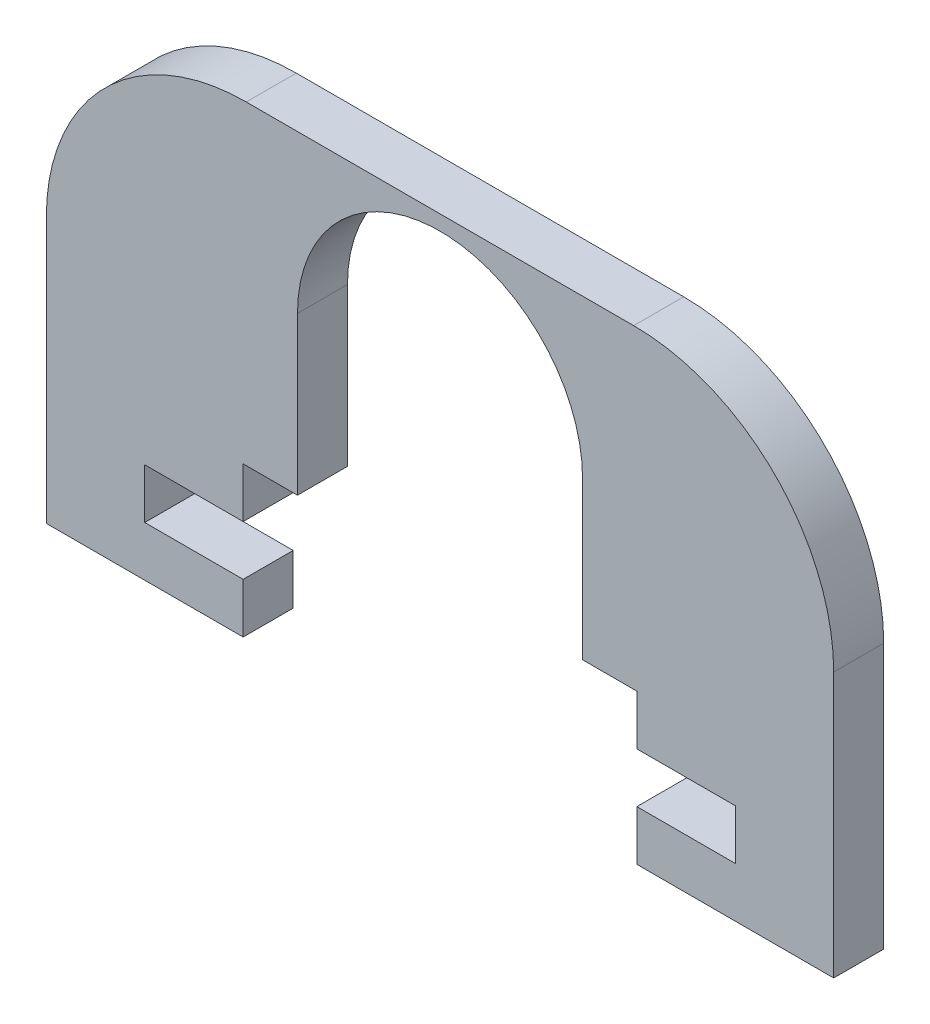
ISO-10303-21;
HEADER;
FILE_DESCRIPTION(('STEP AP214'),'2;1');
FILE_NAME('part.step','',(''),(''),'','','');
FILE_SCHEMA(('AUTOMOTIVE_DESIGN { 1 0 10303 214 1 1 1 1 }'));
ENDSEC;
DATA;
#1=APPLICATION_CONTEXT('core data for automotive mechanical design processes');
#2=APPLICATION_PROTOCOL_DEFINITION('international standard','automotive_design',2000,#1);
#3=PRODUCT_CONTEXT('',#1,'mechanical');
#4=PRODUCT('Part','Part','',(#3));
#5=PRODUCT_RELATED_PRODUCT_CATEGORY('part','',(#4));
#6=PRODUCT_DEFINITION_FORMATION('','',#4);
#7=PRODUCT_DEFINITION_CONTEXT('part definition',#1,'design');
#8=PRODUCT_DEFINITION('design','',#6,#7);
#9=PRODUCT_DEFINITION_SHAPE('','',#8);
#10=(LENGTH_UNIT() NAMED_UNIT(*) SI_UNIT(.MILLI.,.METRE.));
#11=(NAMED_UNIT(*) PLANE_ANGLE_UNIT() SI_UNIT($,.RADIAN.));
#12=(NAMED_UNIT(*) SI_UNIT($,.STERADIAN.) SOLID_ANGLE_UNIT());
#13=UNCERTAINTY_MEASURE_WITH_UNIT(LENGTH_MEASURE(1.E-05),#10,'distance_accuracy_value','');
#14=(GEOMETRIC_REPRESENTATION_CONTEXT(3) GLOBAL_UNCERTAINTY_ASSIGNED_CONTEXT((#13)) GLOBAL_UNIT_ASSIGNED_CONTEXT((#10,
#11,#12)) REPRESENTATION_CONTEXT('',''));
#15=CARTESIAN_POINT('',(0.,0.,0.));
#16=DIRECTION('',(0.,0.,1.));
#17=DIRECTION('',(1.,0.,0.));
#18=AXIS2_PLACEMENT_3D('',#15,#16,#17);
#19=CARTESIAN_POINT('',(0.,0.,6.35));
#20=DIRECTION('',(0.,0.,1.));
#21=DIRECTION('',(1.,0.,0.));
#22=AXIS2_PLACEMENT_3D('',#19,#20,#21);
#23=PLANE('',#22);
#24=DIRECTION('',(-1.,0.,0.));
#25=VECTOR('',#24,1.);
#26=CARTESIAN_POINT('',(0.,-6.35,6.35));
#27=LINE('',#26,#25);
#28=CARTESIAN_POINT('',(24.9999999745,-6.35,6.35));
#29=VERTEX_POINT('',#28);
#30=CARTESIAN_POINT('',(12.49999998725,-6.35,6.35));
#31=VERTEX_POINT('',#30);
#32=EDGE_CURVE('E235',#29,#31,#27,.T.);
#33=ORIENTED_EDGE('',*,*,#32,.F.);
#34=DIRECTION('',(0.,1.,0.));
#35=VECTOR('',#34,1.);
#36=CARTESIAN_POINT('',(24.9999999745,-19.05,6.35));
#37=LINE('',#36,#35);
#38=CARTESIAN_POINT('',(24.9999999745,0.,6.35));
#39=VERTEX_POINT('',#38);
#40=EDGE_CURVE('E271',#29,#39,#37,.T.);
#41=ORIENTED_EDGE('',*,*,#40,.T.);
#42=DIRECTION('',(1.,0.,0.));
#43=VECTOR('',#42,1.);
#44=CARTESIAN_POINT('',(24.9999999745,0.,6.35));
#45=LINE('',#44,#43);
#46=CARTESIAN_POINT('',(31.899999954,0.,6.35));
#47=VERTEX_POINT('',#46);
#48=EDGE_CURVE('E276',#39,#47,#45,.T.);
#49=ORIENTED_EDGE('',*,*,#48,.T.);
#50=DIRECTION('',(0.,-1.,0.));
#51=VECTOR('',#50,1.);
#52=CARTESIAN_POINT('',(31.899999954,0.,6.35));
#53=LINE('',#52,#51);
#54=CARTESIAN_POINT('',(31.899999954,20.000000005,6.35));
#55=VERTEX_POINT('',#54);
#56=EDGE_CURVE('E260',#55,#47,#53,.T.);
#57=ORIENTED_EDGE('',*,*,#56,.F.);
#58=CARTESIAN_POINT('',(49.999999949,20.000000005,6.35));
#59=DIRECTION('',(0.,0.,1.));
#60=DIRECTION('',(1.,0.,0.));
#61=AXIS2_PLACEMENT_3D('',#58,#59,#60);
#62=CIRCLE('',#61,18.099999995);
#63=CARTESIAN_POINT('',(68.099999944,20.000000005,6.35));
#64=VERTEX_POINT('',#63);
#65=EDGE_CURVE('E252',#64,#55,#62,.T.);
#66=ORIENTED_EDGE('',*,*,#65,.F.);
#67=DIRECTION('',(0.,-1.,0.));
#68=VECTOR('',#67,1.);
#69=CARTESIAN_POINT('',(68.099999944,0.,6.35));
#70=LINE('',#69,#68);
#71=CARTESIAN_POINT('',(68.099999944,0.,6.35));
#72=VERTEX_POINT('',#71);
#73=EDGE_CURVE('E262',#64,#72,#70,.T.);
#74=ORIENTED_EDGE('',*,*,#73,.T.);
#75=CARTESIAN_POINT('',(74.9999999235,0.,6.35));
#76=VERTEX_POINT('',#75);
#77=EDGE_CURVE('E275',#72,#76,#45,.T.);
#78=ORIENTED_EDGE('',*,*,#77,.T.);
#79=DIRECTION('',(0.,-1.,0.));
#80=VECTOR('',#79,1.);
#81=CARTESIAN_POINT('',(74.9999999235,0.,6.35));
#82=LINE('',#81,#80);
#83=CARTESIAN_POINT('',(74.9999999235,-6.35,6.35));
#84=VERTEX_POINT('',#83);
#85=EDGE_CURVE('E280',#76,#84,#82,.T.);
#86=ORIENTED_EDGE('',*,*,#85,.T.);
#87=DIRECTION('',(1.,0.,0.));
#88=VECTOR('',#87,1.);
#89=CARTESIAN_POINT('',(0.,-6.34999999999998,6.35));
#90=LINE('',#89,#88);
#91=CARTESIAN_POINT('',(87.49999991075,-6.35,6.35));
#92=VERTEX_POINT('',#91);
#93=EDGE_CURVE('E231',#84,#92,#90,.T.);
#94=ORIENTED_EDGE('',*,*,#93,.T.);
#95=DIRECTION('',(0.,-1.,0.));
#96=VECTOR('',#95,1.);
#97=CARTESIAN_POINT('',(87.49999991075,0.,6.35));
#98=LINE('',#97,#96);
#99=CARTESIAN_POINT('',(87.49999991075,-12.7,6.35));
#100=VERTEX_POINT('',#99);
#101=EDGE_CURVE('E237',#92,#100,#98,.T.);
#102=ORIENTED_EDGE('',*,*,#101,.T.);
#103=DIRECTION('',(-1.,0.,0.));
#104=VECTOR('',#103,1.);
#105=CARTESIAN_POINT('',(0.,-12.7,6.35));
#106=LINE('',#105,#104);
#107=CARTESIAN_POINT('',(74.9999999235,-12.7,6.35));
#108=VERTEX_POINT('',#107);
#109=EDGE_CURVE('E213',#100,#108,#106,.T.);
#110=ORIENTED_EDGE('',*,*,#109,.T.);
#111=CARTESIAN_POINT('',(74.9999999235,-19.05,6.35));
#112=VERTEX_POINT('',#111);
#113=EDGE_CURVE('E279',#108,#112,#82,.T.);
#114=ORIENTED_EDGE('',*,*,#113,.T.);
#115=DIRECTION('',(1.,0.,0.));
#116=VECTOR('',#115,1.);
#117=CARTESIAN_POINT('',(99.999999898,-19.05,6.35));
#118=LINE('',#117,#116);
#119=CARTESIAN_POINT('',(99.999999898,-19.05,6.35));
#120=VERTEX_POINT('',#119);
#121=EDGE_CURVE('E283',#112,#120,#118,.T.);
#122=ORIENTED_EDGE('',*,*,#121,.T.);
#123=DIRECTION('',(0.,1.,0.));
#124=VECTOR('',#123,1.);
#125=CARTESIAN_POINT('',(99.999999898,-6.34999999999999,6.35));
#126=LINE('',#125,#124);
#127=CARTESIAN_POINT('',(99.999999898,14.60000001,6.35));
#128=VERTEX_POINT('',#127);
#129=EDGE_CURVE('E285',#120,#128,#126,.T.);
#130=ORIENTED_EDGE('',*,*,#129,.T.);
#131=CARTESIAN_POINT('',(74.599999898,14.60000001,6.35));
#132=DIRECTION('',(0.,0.,1.));
#133=DIRECTION('',(1.,0.,0.));
#134=AXIS2_PLACEMENT_3D('',#131,#132,#133);
#135=CIRCLE('',#134,25.4);
#136=CARTESIAN_POINT('',(74.599999898,40.00000001,6.35));
#137=VERTEX_POINT('',#136);
#138=EDGE_CURVE('E42',#128,#137,#135,.T.);
#139=ORIENTED_EDGE('',*,*,#138,.T.);
#140=DIRECTION('',(-1.,0.,0.));
#141=VECTOR('',#140,1.);
#142=CARTESIAN_POINT('',(0.,40.00000001,6.35));
#143=LINE('',#142,#141);
#144=CARTESIAN_POINT('',(25.4,40.00000001,6.35));
#145=VERTEX_POINT('',#144);
#146=EDGE_CURVE('E288',#137,#145,#143,.T.);
#147=ORIENTED_EDGE('',*,*,#146,.T.);
#148=CARTESIAN_POINT('',(25.4,14.60000001,6.35));
#149=DIRECTION('',(0.,0.,1.));
#150=DIRECTION('',(1.,0.,0.));
#151=AXIS2_PLACEMENT_3D('',#148,#149,#150);
#152=CIRCLE('',#151,25.4);
#153=CARTESIAN_POINT('',(0.,14.60000001,6.35));
#154=VERTEX_POINT('',#153);
#155=EDGE_CURVE('E345',#145,#154,#152,.T.);
#156=ORIENTED_EDGE('',*,*,#155,.T.);
#157=DIRECTION('',(0.,-1.,0.));
#158=VECTOR('',#157,1.);
#159=CARTESIAN_POINT('',(0.,0.,6.35));
#160=LINE('',#159,#158);
#161=CARTESIAN_POINT('',(0.,-19.05,6.35));
#162=VERTEX_POINT('',#161);
#163=EDGE_CURVE('E266',#154,#162,#160,.T.);
#164=ORIENTED_EDGE('',*,*,#163,.T.);
#165=DIRECTION('',(1.,0.,0.));
#166=VECTOR('',#165,1.);
#167=CARTESIAN_POINT('',(0.,-19.05,6.35));
#168=LINE('',#167,#166);
#169=CARTESIAN_POINT('',(24.9999999745,-19.05,6.35));
#170=VERTEX_POINT('',#169);
#171=EDGE_CURVE('E268',#162,#170,#168,.T.);
#172=ORIENTED_EDGE('',*,*,#171,.T.);
#173=CARTESIAN_POINT('',(24.9999999745,-12.7,6.35));
#174=VERTEX_POINT('',#173);
#175=EDGE_CURVE('E272',#170,#174,#37,.T.);
#176=ORIENTED_EDGE('',*,*,#175,.T.);
#177=DIRECTION('',(1.,0.,0.));
#178=VECTOR('',#177,1.);
#179=CARTESIAN_POINT('',(0.,-12.7,6.35));
#180=LINE('',#179,#178);
#181=CARTESIAN_POINT('',(12.49999998725,-12.7,6.35));
#182=VERTEX_POINT('',#181);
#183=EDGE_CURVE('E49',#182,#174,#180,.T.);
#184=ORIENTED_EDGE('',*,*,#183,.F.);
#185=DIRECTION('',(0.,-1.,0.));
#186=VECTOR('',#185,1.);
#187=CARTESIAN_POINT('',(12.49999998725,0.,6.35));
#188=LINE('',#187,#186);
#189=EDGE_CURVE('E192',#31,#182,#188,.T.);
#190=ORIENTED_EDGE('',*,*,#189,.F.);
#191=EDGE_LOOP('',(#33,#41,#49,#57,#66,#74,#78,#86,#94,#102,#110,#114,#122,#130,#139,#147,#156,
#164,#172,#176,#184,#190));
#192=FACE_BOUND('',#191,.T.);
#193=ADVANCED_FACE('F34',(#192),#23,.T.);
#194=CARTESIAN_POINT('',(0.,0.,0.));
#195=DIRECTION('',(0.,0.,1.));
#196=DIRECTION('',(1.,0.,0.));
#197=AXIS2_PLACEMENT_3D('',#194,#195,#196);
#198=PLANE('',#197);
#199=DIRECTION('',(0.,1.,0.));
#200=VECTOR('',#199,1.);
#201=CARTESIAN_POINT('',(24.9999999745,0.,0.));
#202=LINE('',#201,#200);
#203=CARTESIAN_POINT('',(24.9999999745,-6.35,0.));
#204=VERTEX_POINT('',#203);
#205=CARTESIAN_POINT('',(24.9999999745,0.,0.));
#206=VERTEX_POINT('',#205);
#207=EDGE_CURVE('E294',#204,#206,#202,.T.);
#208=ORIENTED_EDGE('',*,*,#207,.F.);
#209=DIRECTION('',(-1.,0.,0.));
#210=VECTOR('',#209,1.);
#211=CARTESIAN_POINT('',(0.,-6.35,0.));
#212=LINE('',#211,#210);
#213=CARTESIAN_POINT('',(12.49999998725,-6.35,0.));
#214=VERTEX_POINT('',#213);
#215=EDGE_CURVE('E194',#204,#214,#212,.T.);
#216=ORIENTED_EDGE('',*,*,#215,.T.);
#217=DIRECTION('',(0.,-1.,0.));
#218=VECTOR('',#217,1.);
#219=CARTESIAN_POINT('',(12.49999998725,0.,0.));
#220=LINE('',#219,#218);
#221=CARTESIAN_POINT('',(12.49999998725,-12.7,0.));
#222=VERTEX_POINT('',#221);
#223=EDGE_CURVE('E189',#214,#222,#220,.T.);
#224=ORIENTED_EDGE('',*,*,#223,.T.);
#225=DIRECTION('',(1.,0.,0.));
#226=VECTOR('',#225,1.);
#227=CARTESIAN_POINT('',(0.,-12.7,0.));
#228=LINE('',#227,#226);
#229=CARTESIAN_POINT('',(24.9999999745,-12.7,0.));
#230=VERTEX_POINT('',#229);
#231=EDGE_CURVE('E197',#222,#230,#228,.T.);
#232=ORIENTED_EDGE('',*,*,#231,.T.);
#233=CARTESIAN_POINT('',(24.9999999745,-19.05,0.));
#234=VERTEX_POINT('',#233);
#235=EDGE_CURVE('E295',#234,#230,#202,.T.);
#236=ORIENTED_EDGE('',*,*,#235,.F.);
#237=DIRECTION('',(1.,0.,0.));
#238=VECTOR('',#237,1.);
#239=CARTESIAN_POINT('',(0.,-19.05,0.));
#240=LINE('',#239,#238);
#241=CARTESIAN_POINT('',(0.,-19.05,0.));
#242=VERTEX_POINT('',#241);
#243=EDGE_CURVE('E265',#242,#234,#240,.T.);
#244=ORIENTED_EDGE('',*,*,#243,.F.);
#245=DIRECTION('',(0.,-1.,0.));
#246=VECTOR('',#245,1.);
#247=CARTESIAN_POINT('',(0.,0.,0.));
#248=LINE('',#247,#246);
#249=CARTESIAN_POINT('',(0.,14.60000001,0.));
#250=VERTEX_POINT('',#249);
#251=EDGE_CURVE('E269',#250,#242,#248,.T.);
#252=ORIENTED_EDGE('',*,*,#251,.F.);
#253=CARTESIAN_POINT('',(25.4,14.60000001,0.));
#254=DIRECTION('',(0.,0.,1.));
#255=DIRECTION('',(1.,0.,0.));
#256=AXIS2_PLACEMENT_3D('',#253,#254,#255);
#257=CIRCLE('',#256,25.4);
#258=CARTESIAN_POINT('',(25.4,40.00000001,0.));
#259=VERTEX_POINT('',#258);
#260=EDGE_CURVE('E339',#250,#259,#257,.F.);
#261=ORIENTED_EDGE('',*,*,#260,.T.);
#262=DIRECTION('',(-1.,0.,0.));
#263=VECTOR('',#262,1.);
#264=CARTESIAN_POINT('',(0.,40.00000001,0.));
#265=LINE('',#264,#263);
#266=CARTESIAN_POINT('',(74.599999898,40.00000001,0.));
#267=VERTEX_POINT('',#266);
#268=EDGE_CURVE('E311',#267,#259,#265,.T.);
#269=ORIENTED_EDGE('',*,*,#268,.F.);
#270=CARTESIAN_POINT('',(74.599999898,14.60000001,0.));
#271=DIRECTION('',(0.,0.,1.));
#272=DIRECTION('',(1.,0.,0.));
#273=AXIS2_PLACEMENT_3D('',#270,#271,#272);
#274=CIRCLE('',#273,25.4);
#275=CARTESIAN_POINT('',(99.999999898,14.60000001,0.));
#276=VERTEX_POINT('',#275);
#277=EDGE_CURVE('E341',#267,#276,#274,.F.);
#278=ORIENTED_EDGE('',*,*,#277,.T.);
#279=DIRECTION('',(0.,1.,0.));
#280=VECTOR('',#279,1.);
#281=CARTESIAN_POINT('',(99.999999898,0.,0.));
#282=LINE('',#281,#280);
#283=CARTESIAN_POINT('',(99.999999898,-19.05,0.));
#284=VERTEX_POINT('',#283);
#285=EDGE_CURVE('E308',#284,#276,#282,.T.);
#286=ORIENTED_EDGE('',*,*,#285,.F.);
#287=DIRECTION('',(1.,0.,0.));
#288=VECTOR('',#287,1.);
#289=CARTESIAN_POINT('',(99.999999898,-19.05,0.));
#290=LINE('',#289,#288);
#291=CARTESIAN_POINT('',(74.9999999235,-19.05,0.));
#292=VERTEX_POINT('',#291);
#293=EDGE_CURVE('E305',#292,#284,#290,.T.);
#294=ORIENTED_EDGE('',*,*,#293,.F.);
#295=DIRECTION('',(0.,-1.,0.));
#296=VECTOR('',#295,1.);
#297=CARTESIAN_POINT('',(74.9999999235,-19.05,0.));
#298=LINE('',#297,#296);
#299=CARTESIAN_POINT('',(74.9999999235,-12.7,0.));
#300=VERTEX_POINT('',#299);
#301=EDGE_CURVE('E301',#300,#292,#298,.T.);
#302=ORIENTED_EDGE('',*,*,#301,.F.);
#303=DIRECTION('',(-1.,0.,0.));
#304=VECTOR('',#303,1.);
#305=CARTESIAN_POINT('',(0.,-12.7,0.));
#306=LINE('',#305,#304);
#307=CARTESIAN_POINT('',(87.49999991075,-12.7,0.));
#308=VERTEX_POINT('',#307);
#309=EDGE_CURVE('E57',#308,#300,#306,.T.);
#310=ORIENTED_EDGE('',*,*,#309,.F.);
#311=DIRECTION('',(0.,-1.,0.));
#312=VECTOR('',#311,1.);
#313=CARTESIAN_POINT('',(87.49999991075,0.,0.));
#314=LINE('',#313,#312);
#315=CARTESIAN_POINT('',(87.49999991075,-6.35,0.));
#316=VERTEX_POINT('',#315);
#317=EDGE_CURVE('E220',#316,#308,#314,.T.);
#318=ORIENTED_EDGE('',*,*,#317,.F.);
#319=DIRECTION('',(1.,0.,0.));
#320=VECTOR('',#319,1.);
#321=CARTESIAN_POINT('',(0.,-6.34999999999998,0.));
#322=LINE('',#321,#320);
#323=CARTESIAN_POINT('',(74.9999999235,-6.35,0.));
#324=VERTEX_POINT('',#323);
#325=EDGE_CURVE('E217',#324,#316,#322,.T.);
#326=ORIENTED_EDGE('',*,*,#325,.F.);
#327=CARTESIAN_POINT('',(74.9999999235,0.,0.));
#328=VERTEX_POINT('',#327);
#329=EDGE_CURVE('E302',#328,#324,#298,.T.);
#330=ORIENTED_EDGE('',*,*,#329,.F.);
#331=DIRECTION('',(1.,0.,0.));
#332=VECTOR('',#331,1.);
#333=CARTESIAN_POINT('',(24.9999999745,0.,0.));
#334=LINE('',#333,#332);
#335=CARTESIAN_POINT('',(68.099999944,0.,0.));
#336=VERTEX_POINT('',#335);
#337=EDGE_CURVE('E297',#336,#328,#334,.T.);
#338=ORIENTED_EDGE('',*,*,#337,.F.);
#339=DIRECTION('',(0.,-1.,0.));
#340=VECTOR('',#339,1.);
#341=CARTESIAN_POINT('',(68.099999944,0.,0.));
#342=LINE('',#341,#340);
#343=CARTESIAN_POINT('',(68.099999944,20.000000005,0.));
#344=VERTEX_POINT('',#343);
#345=EDGE_CURVE('E241',#344,#336,#342,.T.);
#346=ORIENTED_EDGE('',*,*,#345,.F.);
#347=CARTESIAN_POINT('',(49.999999949,20.000000005,0.));
#348=DIRECTION('',(0.,0.,1.));
#349=DIRECTION('',(1.,0.,0.));
#350=AXIS2_PLACEMENT_3D('',#347,#348,#349);
#351=CIRCLE('',#350,18.099999995);
#352=CARTESIAN_POINT('',(31.899999954,20.000000005,0.));
#353=VERTEX_POINT('',#352);
#354=EDGE_CURVE('E243',#344,#353,#351,.T.);
#355=ORIENTED_EDGE('',*,*,#354,.T.);
#356=DIRECTION('',(0.,-1.,0.));
#357=VECTOR('',#356,1.);
#358=CARTESIAN_POINT('',(31.899999954,0.,0.));
#359=LINE('',#358,#357);
#360=CARTESIAN_POINT('',(31.899999954,0.,0.));
#361=VERTEX_POINT('',#360);
#362=EDGE_CURVE('E246',#353,#361,#359,.T.);
#363=ORIENTED_EDGE('',*,*,#362,.T.);
#364=EDGE_CURVE('E298',#206,#361,#334,.T.);
#365=ORIENTED_EDGE('',*,*,#364,.F.);
#366=EDGE_LOOP('',(#208,#216,#224,#232,#236,#244,#252,#261,#269,#278,#286,#294,#302,#310,#318,
#326,#330,#338,#346,#355,#363,#365));
#367=FACE_BOUND('',#366,.T.);
#368=ADVANCED_FACE('F203',(#367),#198,.F.);
#369=CARTESIAN_POINT('',(24.9999999745,0.,6.35));
#370=DIRECTION('',(-1.,0.,0.));
#371=DIRECTION('',(0.,0.,1.));
#372=AXIS2_PLACEMENT_3D('',#369,#370,#371);
#373=PLANE('',#372);
#374=ORIENTED_EDGE('',*,*,#40,.F.);
#375=DIRECTION('',(0.,0.,1.));
#376=VECTOR('',#375,1.);
#377=CARTESIAN_POINT('',(24.9999999745,-6.35,0.));
#378=LINE('',#377,#376);
#379=EDGE_CURVE('E214',#204,#29,#378,.T.);
#380=ORIENTED_EDGE('',*,*,#379,.F.);
#381=ORIENTED_EDGE('',*,*,#207,.T.);
#382=DIRECTION('',(0.,0.,-1.));
#383=VECTOR('',#382,1.);
#384=CARTESIAN_POINT('',(24.9999999745,0.,6.35));
#385=LINE('',#384,#383);
#386=EDGE_CURVE('E323',#39,#206,#385,.T.);
#387=ORIENTED_EDGE('',*,*,#386,.F.);
#388=EDGE_LOOP('',(#374,#380,#381,#387));
#389=FACE_BOUND('',#388,.T.);
#390=ADVANCED_FACE('F408',(#389),#373,.F.);
#391=CARTESIAN_POINT('',(74.9999999235,-19.05,6.35));
#392=DIRECTION('',(1.,0.,0.));
#393=DIRECTION('',(0.,0.,-1.));
#394=AXIS2_PLACEMENT_3D('',#391,#392,#393);
#395=PLANE('',#394);
#396=DIRECTION('',(0.,0.,1.));
#397=VECTOR('',#396,1.);
#398=CARTESIAN_POINT('',(74.9999999235,-6.35,0.));
#399=LINE('',#398,#397);
#400=EDGE_CURVE('E221',#324,#84,#399,.T.);
#401=ORIENTED_EDGE('',*,*,#400,.T.);
#402=ORIENTED_EDGE('',*,*,#85,.F.);
#403=DIRECTION('',(0.,0.,-1.));
#404=VECTOR('',#403,1.);
#405=CARTESIAN_POINT('',(74.9999999235,0.,6.35));
#406=LINE('',#405,#404);
#407=EDGE_CURVE('E320',#76,#328,#406,.T.);
#408=ORIENTED_EDGE('',*,*,#407,.T.);
#409=ORIENTED_EDGE('',*,*,#329,.T.);
#410=EDGE_LOOP('',(#401,#402,#408,#409));
#411=FACE_BOUND('',#410,.T.);
#412=ADVANCED_FACE('F383',(#411),#395,.F.);
#413=DIRECTION('',(0.,0.,1.));
#414=VECTOR('',#413,1.);
#415=CARTESIAN_POINT('',(74.9999999235,-12.7,0.));
#416=LINE('',#415,#414);
#417=EDGE_CURVE('E225',#300,#108,#416,.T.);
#418=ORIENTED_EDGE('',*,*,#417,.F.);
#419=ORIENTED_EDGE('',*,*,#301,.T.);
#420=DIRECTION('',(0.,0.,-1.));
#421=VECTOR('',#420,1.);
#422=CARTESIAN_POINT('',(74.9999999235,-19.05,6.35));
#423=LINE('',#422,#421);
#424=EDGE_CURVE('E317',#112,#292,#423,.T.);
#425=ORIENTED_EDGE('',*,*,#424,.F.);
#426=ORIENTED_EDGE('',*,*,#113,.F.);
#427=EDGE_LOOP('',(#418,#419,#425,#426));
#428=FACE_BOUND('',#427,.T.);
#429=ADVANCED_FACE('F371',(#428),#395,.F.);
#430=CARTESIAN_POINT('',(24.9999999745,0.,6.35));
#431=DIRECTION('',(0.,1.,0.));
#432=DIRECTION('',(-1.,0.,0.));
#433=AXIS2_PLACEMENT_3D('',#430,#431,#432);
#434=PLANE('',#433);
#435=DIRECTION('',(0.,0.,1.));
#436=VECTOR('',#435,1.);
#437=CARTESIAN_POINT('',(68.099999944,0.,0.));
#438=LINE('',#437,#436);
#439=EDGE_CURVE('E250',#336,#72,#438,.T.);
#440=ORIENTED_EDGE('',*,*,#439,.F.);
#441=ORIENTED_EDGE('',*,*,#337,.T.);
#442=ORIENTED_EDGE('',*,*,#407,.F.);
#443=ORIENTED_EDGE('',*,*,#77,.F.);
#444=EDGE_LOOP('',(#440,#441,#442,#443));
#445=FACE_BOUND('',#444,.T.);
#446=ADVANCED_FACE('F389',(#445),#434,.F.);
#447=CARTESIAN_POINT('',(0.,-19.05,6.35));
#448=DIRECTION('',(0.,1.,0.));
#449=DIRECTION('',(0.,0.,1.));
#450=AXIS2_PLACEMENT_3D('',#447,#448,#449);
#451=PLANE('',#450);
#452=ORIENTED_EDGE('',*,*,#243,.T.);
#453=DIRECTION('',(0.,0.,-1.));
#454=VECTOR('',#453,1.);
#455=CARTESIAN_POINT('',(24.9999999745,-19.05,6.35));
#456=LINE('',#455,#454);
#457=EDGE_CURVE('E326',#170,#234,#456,.T.);
#458=ORIENTED_EDGE('',*,*,#457,.F.);
#459=ORIENTED_EDGE('',*,*,#171,.F.);
#460=DIRECTION('',(0.,0.,-1.));
#461=VECTOR('',#460,1.);
#462=CARTESIAN_POINT('',(0.,-19.05,6.35));
#463=LINE('',#462,#461);
#464=EDGE_CURVE('E329',#162,#242,#463,.T.);
#465=ORIENTED_EDGE('',*,*,#464,.T.);
#466=EDGE_LOOP('',(#452,#458,#459,#465));
#467=FACE_BOUND('',#466,.T.);
#468=ADVANCED_FACE('F420',(#467),#451,.F.);
#469=ORIENTED_EDGE('',*,*,#235,.T.);
#470=DIRECTION('',(0.,0.,1.));
#471=VECTOR('',#470,1.);
#472=CARTESIAN_POINT('',(24.9999999745,-12.7,0.));
#473=LINE('',#472,#471);
#474=EDGE_CURVE('E193',#230,#174,#473,.T.);
#475=ORIENTED_EDGE('',*,*,#474,.T.);
#476=ORIENTED_EDGE('',*,*,#175,.F.);
#477=ORIENTED_EDGE('',*,*,#457,.T.);
#478=EDGE_LOOP('',(#469,#475,#476,#477));
#479=FACE_BOUND('',#478,.T.);
#480=ADVANCED_FACE('F416',(#479),#373,.F.);
#481=ORIENTED_EDGE('',*,*,#364,.T.);
#482=DIRECTION('',(0.,0.,1.));
#483=VECTOR('',#482,1.);
#484=CARTESIAN_POINT('',(31.899999954,0.,0.));
#485=LINE('',#484,#483);
#486=EDGE_CURVE('E253',#361,#47,#485,.T.);
#487=ORIENTED_EDGE('',*,*,#486,.T.);
#488=ORIENTED_EDGE('',*,*,#48,.F.);
#489=ORIENTED_EDGE('',*,*,#386,.T.);
#490=EDGE_LOOP('',(#481,#487,#488,#489));
#491=FACE_BOUND('',#490,.T.);
#492=ADVANCED_FACE('F403',(#491),#434,.F.);
#493=CARTESIAN_POINT('',(99.999999898,-19.05,6.35));
#494=DIRECTION('',(0.,1.,0.));
#495=DIRECTION('',(-1.,0.,0.));
#496=AXIS2_PLACEMENT_3D('',#493,#494,#495);
#497=PLANE('',#496);
#498=ORIENTED_EDGE('',*,*,#293,.T.);
#499=DIRECTION('',(0.,0.,-1.));
#500=VECTOR('',#499,1.);
#501=CARTESIAN_POINT('',(99.999999898,-19.05,6.35));
#502=LINE('',#501,#500);
#503=EDGE_CURVE('E291',#120,#284,#502,.T.);
#504=ORIENTED_EDGE('',*,*,#503,.F.);
#505=ORIENTED_EDGE('',*,*,#121,.F.);
#506=ORIENTED_EDGE('',*,*,#424,.T.);
#507=EDGE_LOOP('',(#498,#504,#505,#506));
#508=FACE_BOUND('',#507,.T.);
#509=ADVANCED_FACE('F366',(#508),#497,.F.);
#510=CARTESIAN_POINT('',(99.999999898,0.,6.35));
#511=DIRECTION('',(-1.,0.,0.));
#512=DIRECTION('',(0.,-1.,0.));
#513=AXIS2_PLACEMENT_3D('',#510,#511,#512);
#514=PLANE('',#513);
#515=ORIENTED_EDGE('',*,*,#285,.T.);
#516=DIRECTION('',(0.,0.,-1.));
#517=VECTOR('',#516,1.);
#518=CARTESIAN_POINT('',(99.999999898,14.60000001,6.35));
#519=LINE('',#518,#517);
#520=EDGE_CURVE('E343',#276,#128,#519,.F.);
#521=ORIENTED_EDGE('',*,*,#520,.T.);
#522=ORIENTED_EDGE('',*,*,#129,.F.);
#523=ORIENTED_EDGE('',*,*,#503,.T.);
#524=EDGE_LOOP('',(#515,#521,#522,#523));
#525=FACE_BOUND('',#524,.T.);
#526=ADVANCED_FACE('F362',(#525),#514,.F.);
#527=CARTESIAN_POINT('',(0.,40.00000001,6.35));
#528=DIRECTION('',(0.,-1.,0.));
#529=DIRECTION('',(1.,0.,0.));
#530=AXIS2_PLACEMENT_3D('',#527,#528,#529);
#531=PLANE('',#530);
#532=ORIENTED_EDGE('',*,*,#146,.F.);
#533=DIRECTION('',(0.,0.,-1.));
#534=VECTOR('',#533,1.);
#535=CARTESIAN_POINT('',(74.599999898,40.00000001,6.35));
#536=LINE('',#535,#534);
#537=EDGE_CURVE('E336',#137,#267,#536,.T.);
#538=ORIENTED_EDGE('',*,*,#537,.T.);
#539=ORIENTED_EDGE('',*,*,#268,.T.);
#540=DIRECTION('',(0.,0.,-1.));
#541=VECTOR('',#540,1.);
#542=CARTESIAN_POINT('',(25.4,40.00000001,6.35));
#543=LINE('',#542,#541);
#544=EDGE_CURVE('E332',#259,#145,#543,.F.);
#545=ORIENTED_EDGE('',*,*,#544,.T.);
#546=EDGE_LOOP('',(#532,#538,#539,#545));
#547=FACE_BOUND('',#546,.T.);
#548=ADVANCED_FACE('F356',(#547),#531,.F.);
#549=CARTESIAN_POINT('',(0.,0.,6.35));
#550=DIRECTION('',(1.,0.,0.));
#551=DIRECTION('',(0.,0.,-1.));
#552=AXIS2_PLACEMENT_3D('',#549,#550,#551);
#553=PLANE('',#552);
#554=ORIENTED_EDGE('',*,*,#163,.F.);
#555=DIRECTION('',(0.,0.,-1.));
#556=VECTOR('',#555,1.);
#557=CARTESIAN_POINT('',(0.,14.60000001,6.35));
#558=LINE('',#557,#556);
#559=EDGE_CURVE('E11',#154,#250,#558,.T.);
#560=ORIENTED_EDGE('',*,*,#559,.T.);
#561=ORIENTED_EDGE('',*,*,#251,.T.);
#562=ORIENTED_EDGE('',*,*,#464,.F.);
#563=EDGE_LOOP('',(#554,#560,#561,#562));
#564=FACE_BOUND('',#563,.T.);
#565=ADVANCED_FACE('F424',(#564),#553,.F.);
#566=CARTESIAN_POINT('',(68.099999944,0.,0.));
#567=DIRECTION('',(-1.,0.,0.));
#568=DIRECTION('',(0.,0.,1.));
#569=AXIS2_PLACEMENT_3D('',#566,#567,#568);
#570=PLANE('',#569);
#571=DIRECTION('',(0.,0.,1.));
#572=VECTOR('',#571,1.);
#573=CARTESIAN_POINT('',(68.099999944,20.000000005,0.));
#574=LINE('',#573,#572);
#575=EDGE_CURVE('E249',#344,#64,#574,.T.);
#576=ORIENTED_EDGE('',*,*,#575,.F.);
#577=ORIENTED_EDGE('',*,*,#345,.T.);
#578=ORIENTED_EDGE('',*,*,#439,.T.);
#579=ORIENTED_EDGE('',*,*,#73,.F.);
#580=EDGE_LOOP('',(#576,#577,#578,#579));
#581=FACE_BOUND('',#580,.T.);
#582=ADVANCED_FACE('F393',(#581),#570,.T.);
#583=CARTESIAN_POINT('',(31.899999954,0.,0.));
#584=DIRECTION('',(-1.,0.,0.));
#585=DIRECTION('',(0.,-1.,0.));
#586=AXIS2_PLACEMENT_3D('',#583,#584,#585);
#587=PLANE('',#586);
#588=ORIENTED_EDGE('',*,*,#56,.T.);
#589=ORIENTED_EDGE('',*,*,#486,.F.);
#590=ORIENTED_EDGE('',*,*,#362,.F.);
#591=DIRECTION('',(0.,0.,1.));
#592=VECTOR('',#591,1.);
#593=CARTESIAN_POINT('',(31.899999954,20.000000005,0.));
#594=LINE('',#593,#592);
#595=EDGE_CURVE('E256',#353,#55,#594,.T.);
#596=ORIENTED_EDGE('',*,*,#595,.T.);
#597=EDGE_LOOP('',(#588,#589,#590,#596));
#598=FACE_BOUND('',#597,.T.);
#599=ADVANCED_FACE('F400',(#598),#587,.F.);
#600=CARTESIAN_POINT('',(49.999999949,20.000000005,0.));
#601=DIRECTION('',(0.,0.,1.));
#602=DIRECTION('',(1.,0.,0.));
#603=AXIS2_PLACEMENT_3D('',#600,#601,#602);
#604=CYLINDRICAL_SURFACE('',#603,18.099999995);
#605=ORIENTED_EDGE('',*,*,#65,.T.);
#606=ORIENTED_EDGE('',*,*,#595,.F.);
#607=ORIENTED_EDGE('',*,*,#354,.F.);
#608=ORIENTED_EDGE('',*,*,#575,.T.);
#609=EDGE_LOOP('',(#605,#606,#607,#608));
#610=FACE_BOUND('',#609,.T.);
#611=ADVANCED_FACE('F397',(#610),#604,.F.);
#612=CARTESIAN_POINT('',(74.599999898,14.60000001,6.35));
#613=DIRECTION('',(0.,0.,-1.));
#614=DIRECTION('',(-1.,0.,0.));
#615=AXIS2_PLACEMENT_3D('',#612,#613,#614);
#616=CYLINDRICAL_SURFACE('',#615,25.4);
#617=ORIENTED_EDGE('',*,*,#138,.F.);
#618=ORIENTED_EDGE('',*,*,#520,.F.);
#619=ORIENTED_EDGE('',*,*,#277,.F.);
#620=ORIENTED_EDGE('',*,*,#537,.F.);
#621=EDGE_LOOP('',(#617,#618,#619,#620));
#622=FACE_BOUND('',#621,.T.);
#623=ADVANCED_FACE('F359',(#622),#616,.T.);
#624=CARTESIAN_POINT('',(25.4,14.60000001,6.35));
#625=DIRECTION('',(0.,0.,-1.));
#626=DIRECTION('',(-1.,0.,0.));
#627=AXIS2_PLACEMENT_3D('',#624,#625,#626);
#628=CYLINDRICAL_SURFACE('',#627,25.4);
#629=ORIENTED_EDGE('',*,*,#155,.F.);
#630=ORIENTED_EDGE('',*,*,#544,.F.);
#631=ORIENTED_EDGE('',*,*,#260,.F.);
#632=ORIENTED_EDGE('',*,*,#559,.F.);
#633=EDGE_LOOP('',(#629,#630,#631,#632));
#634=FACE_BOUND('',#633,.T.);
#635=ADVANCED_FACE('F36',(#634),#628,.T.);
#636=CARTESIAN_POINT('',(0.,-6.34999999999998,0.));
#637=DIRECTION('',(0.,-1.,0.));
#638=DIRECTION('',(1.,0.,0.));
#639=AXIS2_PLACEMENT_3D('',#636,#637,#638);
#640=PLANE('',#639);
#641=ORIENTED_EDGE('',*,*,#400,.F.);
#642=ORIENTED_EDGE('',*,*,#325,.T.);
#643=DIRECTION('',(0.,0.,1.));
#644=VECTOR('',#643,1.);
#645=CARTESIAN_POINT('',(87.49999991075,-6.35,0.));
#646=LINE('',#645,#644);
#647=EDGE_CURVE('E204',#316,#92,#646,.T.);
#648=ORIENTED_EDGE('',*,*,#647,.T.);
#649=ORIENTED_EDGE('',*,*,#93,.F.);
#650=EDGE_LOOP('',(#641,#642,#648,#649));
#651=FACE_BOUND('',#650,.T.);
#652=ADVANCED_FACE('F378',(#651),#640,.T.);
#653=CARTESIAN_POINT('',(87.49999991075,0.,0.));
#654=DIRECTION('',(-1.,0.,0.));
#655=DIRECTION('',(0.,0.,1.));
#656=AXIS2_PLACEMENT_3D('',#653,#654,#655);
#657=PLANE('',#656);
#658=ORIENTED_EDGE('',*,*,#647,.F.);
#659=ORIENTED_EDGE('',*,*,#317,.T.);
#660=DIRECTION('',(0.,0.,1.));
#661=VECTOR('',#660,1.);
#662=CARTESIAN_POINT('',(87.49999991075,-12.7,0.));
#663=LINE('',#662,#661);
#664=EDGE_CURVE('E207',#308,#100,#663,.T.);
#665=ORIENTED_EDGE('',*,*,#664,.T.);
#666=ORIENTED_EDGE('',*,*,#101,.F.);
#667=EDGE_LOOP('',(#658,#659,#665,#666));
#668=FACE_BOUND('',#667,.T.);
#669=ADVANCED_FACE('F376',(#668),#657,.T.);
#670=CARTESIAN_POINT('',(0.,-12.7,0.));
#671=DIRECTION('',(0.,1.,0.));
#672=DIRECTION('',(0.,0.,1.));
#673=AXIS2_PLACEMENT_3D('',#670,#671,#672);
#674=PLANE('',#673);
#675=ORIENTED_EDGE('',*,*,#664,.F.);
#676=ORIENTED_EDGE('',*,*,#309,.T.);
#677=ORIENTED_EDGE('',*,*,#417,.T.);
#678=ORIENTED_EDGE('',*,*,#109,.F.);
#679=EDGE_LOOP('',(#675,#676,#677,#678));
#680=FACE_BOUND('',#679,.T.);
#681=ADVANCED_FACE('F373',(#680),#674,.T.);
#682=CARTESIAN_POINT('',(12.49999998725,0.,0.));
#683=DIRECTION('',(-1.,0.,0.));
#684=DIRECTION('',(0.,0.,1.));
#685=AXIS2_PLACEMENT_3D('',#682,#683,#684);
#686=PLANE('',#685);
#687=ORIENTED_EDGE('',*,*,#189,.T.);
#688=DIRECTION('',(0.,0.,1.));
#689=VECTOR('',#688,1.);
#690=CARTESIAN_POINT('',(12.49999998725,-12.7,0.));
#691=LINE('',#690,#689);
#692=EDGE_CURVE('E184',#222,#182,#691,.T.);
#693=ORIENTED_EDGE('',*,*,#692,.F.);
#694=ORIENTED_EDGE('',*,*,#223,.F.);
#695=DIRECTION('',(0.,0.,1.));
#696=VECTOR('',#695,1.);
#697=CARTESIAN_POINT('',(12.49999998725,-6.35,0.));
#698=LINE('',#697,#696);
#699=EDGE_CURVE('E211',#214,#31,#698,.T.);
#700=ORIENTED_EDGE('',*,*,#699,.T.);
#701=EDGE_LOOP('',(#687,#693,#694,#700));
#702=FACE_BOUND('',#701,.T.);
#703=ADVANCED_FACE('F186',(#702),#686,.F.);
#704=CARTESIAN_POINT('',(0.,-6.35,0.));
#705=DIRECTION('',(0.,1.,0.));
#706=DIRECTION('',(-1.,0.,0.));
#707=AXIS2_PLACEMENT_3D('',#704,#705,#706);
#708=PLANE('',#707);
#709=ORIENTED_EDGE('',*,*,#32,.T.);
#710=ORIENTED_EDGE('',*,*,#699,.F.);
#711=ORIENTED_EDGE('',*,*,#215,.F.);
#712=ORIENTED_EDGE('',*,*,#379,.T.);
#713=EDGE_LOOP('',(#709,#710,#711,#712));
#714=FACE_BOUND('',#713,.T.);
#715=ADVANCED_FACE('F411',(#714),#708,.F.);
#716=CARTESIAN_POINT('',(0.,-12.7,0.));
#717=DIRECTION('',(0.,-1.,0.));
#718=DIRECTION('',(0.,0.,-1.));
#719=AXIS2_PLACEMENT_3D('',#716,#717,#718);
#720=PLANE('',#719);
#721=ORIENTED_EDGE('',*,*,#183,.T.);
#722=ORIENTED_EDGE('',*,*,#474,.F.);
#723=ORIENTED_EDGE('',*,*,#231,.F.);
#724=ORIENTED_EDGE('',*,*,#692,.T.);
#725=EDGE_LOOP('',(#721,#722,#723,#724));
#726=FACE_BOUND('',#725,.T.);
#727=ADVANCED_FACE('F198',(#726),#720,.F.);
#728=CLOSED_SHELL('',(#193,#368,#390,#412,#429,#446,#468,#480,#492,#509,#526,#548,#565,#582,
#599,#611,#623,#635,#652,#669,#681,#703,#715,#727));
#729=MANIFOLD_SOLID_BREP('B2',#728);
#730=ADVANCED_BREP_SHAPE_REPRESENTATION('',(#18,#729),#14);
#731=SHAPE_DEFINITION_REPRESENTATION(#9,#730);
ENDSEC;
END-ISO-10303-21;
